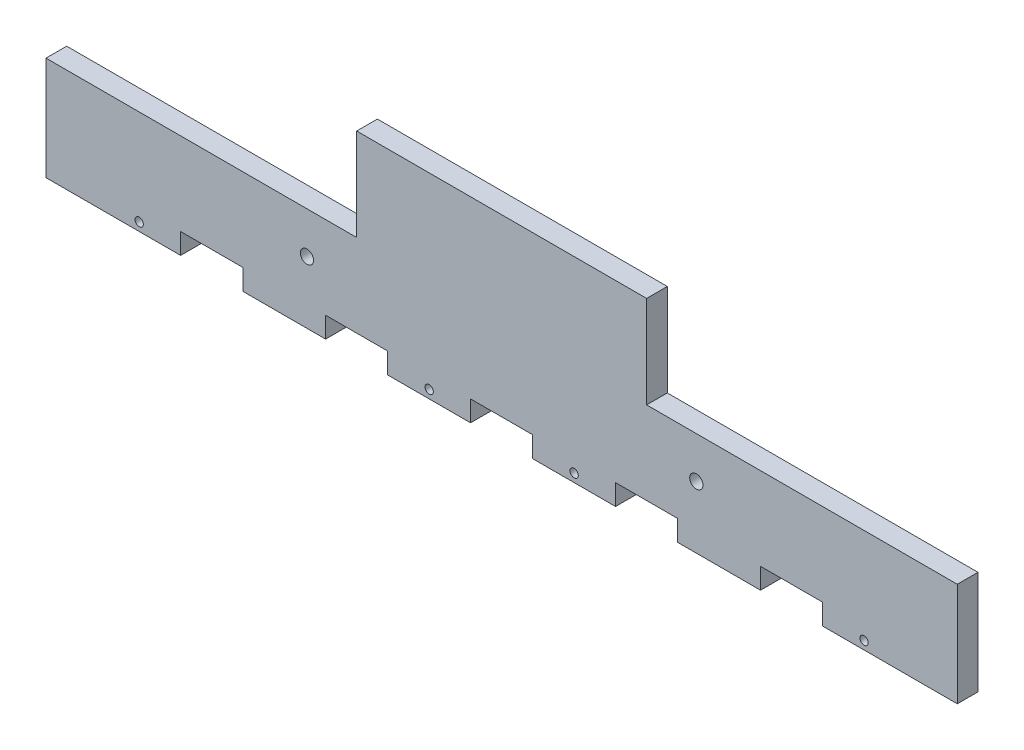
ISO-10303-21;
HEADER;
FILE_DESCRIPTION(('STEP AP214'),'2;1');
FILE_NAME('part.step','',(''),(''),'','','');
FILE_SCHEMA(('AUTOMOTIVE_DESIGN { 1 0 10303 214 1 1 1 1 }'));
ENDSEC;
DATA;
#1=APPLICATION_CONTEXT('core data for automotive mechanical design processes');
#2=APPLICATION_PROTOCOL_DEFINITION('international standard','automotive_design',2000,#1);
#3=PRODUCT_CONTEXT('',#1,'mechanical');
#4=PRODUCT('Part','Part','',(#3));
#5=PRODUCT_RELATED_PRODUCT_CATEGORY('part','',(#4));
#6=PRODUCT_DEFINITION_FORMATION('','',#4);
#7=PRODUCT_DEFINITION_CONTEXT('part definition',#1,'design');
#8=PRODUCT_DEFINITION('design','',#6,#7);
#9=PRODUCT_DEFINITION_SHAPE('','',#8);
#10=(LENGTH_UNIT() NAMED_UNIT(*) SI_UNIT(.MILLI.,.METRE.));
#11=(NAMED_UNIT(*) PLANE_ANGLE_UNIT() SI_UNIT($,.RADIAN.));
#12=(NAMED_UNIT(*) SI_UNIT($,.STERADIAN.) SOLID_ANGLE_UNIT());
#13=UNCERTAINTY_MEASURE_WITH_UNIT(LENGTH_MEASURE(1.E-05),#10,'distance_accuracy_value','');
#14=(GEOMETRIC_REPRESENTATION_CONTEXT(3) GLOBAL_UNCERTAINTY_ASSIGNED_CONTEXT((#13)) GLOBAL_UNIT_ASSIGNED_CONTEXT((#10,
#11,#12)) REPRESENTATION_CONTEXT('',''));
#15=CARTESIAN_POINT('',(0.,0.,0.));
#16=DIRECTION('',(0.,0.,1.));
#17=DIRECTION('',(1.,0.,0.));
#18=AXIS2_PLACEMENT_3D('',#15,#16,#17);
#19=CARTESIAN_POINT('',(0.,0.,5.));
#20=DIRECTION('',(0.,1.,0.));
#21=DIRECTION('',(0.,0.,1.));
#22=AXIS2_PLACEMENT_3D('',#19,#20,#21);
#23=PLANE('',#22);
#24=DIRECTION('',(1.,0.,0.));
#25=VECTOR('',#24,1.);
#26=CARTESIAN_POINT('',(0.,0.,0.));
#27=LINE('',#26,#25);
#28=CARTESIAN_POINT('',(0.,0.,0.));
#29=VERTEX_POINT('',#28);
#30=CARTESIAN_POINT('',(32.5,0.,0.));
#31=VERTEX_POINT('',#30);
#32=EDGE_CURVE('E263',#29,#31,#27,.T.);
#33=ORIENTED_EDGE('',*,*,#32,.T.);
#34=DIRECTION('',(0.,0.,1.));
#35=VECTOR('',#34,1.);
#36=CARTESIAN_POINT('',(32.5,0.,0.));
#37=LINE('',#36,#35);
#38=CARTESIAN_POINT('',(32.5,0.,5.));
#39=VERTEX_POINT('',#38);
#40=EDGE_CURVE('E394',#31,#39,#37,.T.);
#41=ORIENTED_EDGE('',*,*,#40,.T.);
#42=DIRECTION('',(1.,0.,0.));
#43=VECTOR('',#42,1.);
#44=CARTESIAN_POINT('',(0.,0.,5.));
#45=LINE('',#44,#43);
#46=CARTESIAN_POINT('',(0.,0.,5.));
#47=VERTEX_POINT('',#46);
#48=EDGE_CURVE('E319',#47,#39,#45,.T.);
#49=ORIENTED_EDGE('',*,*,#48,.F.);
#50=DIRECTION('',(0.,0.,-1.));
#51=VECTOR('',#50,1.);
#52=CARTESIAN_POINT('',(0.,0.,5.));
#53=LINE('',#52,#51);
#54=EDGE_CURVE('E11',#47,#29,#53,.T.);
#55=ORIENTED_EDGE('',*,*,#54,.T.);
#56=EDGE_LOOP('',(#33,#41,#49,#55));
#57=FACE_BOUND('',#56,.T.);
#58=ADVANCED_FACE('F38',(#57),#23,.F.);
#59=CARTESIAN_POINT('',(82.5,0.,5.));
#60=VERTEX_POINT('',#59);
#61=CARTESIAN_POINT('',(102.5,0.,5.));
#62=VERTEX_POINT('',#61);
#63=EDGE_CURVE('E609',#60,#62,#45,.T.);
#64=ORIENTED_EDGE('',*,*,#63,.F.);
#65=DIRECTION('',(0.,0.,1.));
#66=VECTOR('',#65,1.);
#67=CARTESIAN_POINT('',(82.5,0.,0.));
#68=LINE('',#67,#66);
#69=CARTESIAN_POINT('',(82.5,0.,0.));
#70=VERTEX_POINT('',#69);
#71=EDGE_CURVE('E439',#70,#60,#68,.T.);
#72=ORIENTED_EDGE('',*,*,#71,.F.);
#73=CARTESIAN_POINT('',(102.5,0.,0.));
#74=VERTEX_POINT('',#73);
#75=EDGE_CURVE('E254',#70,#74,#27,.T.);
#76=ORIENTED_EDGE('',*,*,#75,.T.);
#77=DIRECTION('',(0.,0.,1.));
#78=VECTOR('',#77,1.);
#79=CARTESIAN_POINT('',(102.5,0.,0.));
#80=LINE('',#79,#78);
#81=EDGE_CURVE('E360',#74,#62,#80,.T.);
#82=ORIENTED_EDGE('',*,*,#81,.T.);
#83=EDGE_LOOP('',(#64,#72,#76,#82));
#84=FACE_BOUND('',#83,.T.);
#85=ADVANCED_FACE('F658',(#84),#23,.F.);
#86=CARTESIAN_POINT('',(152.5,0.,0.));
#87=VERTEX_POINT('',#86);
#88=CARTESIAN_POINT('',(172.5,0.,0.));
#89=VERTEX_POINT('',#88);
#90=EDGE_CURVE('E255',#87,#89,#27,.T.);
#91=ORIENTED_EDGE('',*,*,#90,.T.);
#92=DIRECTION('',(0.,0.,1.));
#93=VECTOR('',#92,1.);
#94=CARTESIAN_POINT('',(172.5,0.,0.));
#95=LINE('',#94,#93);
#96=CARTESIAN_POINT('',(172.5,0.,5.));
#97=VERTEX_POINT('',#96);
#98=EDGE_CURVE('E463',#89,#97,#95,.T.);
#99=ORIENTED_EDGE('',*,*,#98,.T.);
#100=CARTESIAN_POINT('',(152.5,0.,5.));
#101=VERTEX_POINT('',#100);
#102=EDGE_CURVE('E617',#101,#97,#45,.T.);
#103=ORIENTED_EDGE('',*,*,#102,.F.);
#104=DIRECTION('',(0.,0.,1.));
#105=VECTOR('',#104,1.);
#106=CARTESIAN_POINT('',(152.5,0.,0.));
#107=LINE('',#106,#105);
#108=EDGE_CURVE('E236',#87,#101,#107,.T.);
#109=ORIENTED_EDGE('',*,*,#108,.F.);
#110=EDGE_LOOP('',(#91,#99,#103,#109));
#111=FACE_BOUND('',#110,.T.);
#112=ADVANCED_FACE('F639',(#111),#23,.F.);
#113=CARTESIAN_POINT('',(117.5,0.,0.));
#114=VERTEX_POINT('',#113);
#115=CARTESIAN_POINT('',(137.5,0.,0.));
#116=VERTEX_POINT('',#115);
#117=EDGE_CURVE('E244',#114,#116,#27,.T.);
#118=ORIENTED_EDGE('',*,*,#117,.T.);
#119=DIRECTION('',(0.,0.,1.));
#120=VECTOR('',#119,1.);
#121=CARTESIAN_POINT('',(137.5,0.,0.));
#122=LINE('',#121,#120);
#123=CARTESIAN_POINT('',(137.5,0.,5.));
#124=VERTEX_POINT('',#123);
#125=EDGE_CURVE('E224',#116,#124,#122,.T.);
#126=ORIENTED_EDGE('',*,*,#125,.T.);
#127=CARTESIAN_POINT('',(117.5,0.,5.));
#128=VERTEX_POINT('',#127);
#129=EDGE_CURVE('E612',#128,#124,#45,.T.);
#130=ORIENTED_EDGE('',*,*,#129,.F.);
#131=DIRECTION('',(0.,0.,1.));
#132=VECTOR('',#131,1.);
#133=CARTESIAN_POINT('',(117.5,0.,0.));
#134=LINE('',#133,#132);
#135=EDGE_CURVE('E252',#114,#128,#134,.T.);
#136=ORIENTED_EDGE('',*,*,#135,.F.);
#137=EDGE_LOOP('',(#118,#126,#130,#136));
#138=FACE_BOUND('',#137,.T.);
#139=ADVANCED_FACE('F251',(#138),#23,.F.);
#140=CARTESIAN_POINT('',(47.5,0.,5.));
#141=VERTEX_POINT('',#140);
#142=CARTESIAN_POINT('',(67.5,0.,5.));
#143=VERTEX_POINT('',#142);
#144=EDGE_CURVE('E323',#141,#143,#45,.T.);
#145=ORIENTED_EDGE('',*,*,#144,.F.);
#146=DIRECTION('',(0.,0.,1.));
#147=VECTOR('',#146,1.);
#148=CARTESIAN_POINT('',(47.5,0.,0.));
#149=LINE('',#148,#147);
#150=CARTESIAN_POINT('',(47.5,0.,0.));
#151=VERTEX_POINT('',#150);
#152=EDGE_CURVE('E398',#151,#141,#149,.T.);
#153=ORIENTED_EDGE('',*,*,#152,.F.);
#154=CARTESIAN_POINT('',(67.5,0.,0.));
#155=VERTEX_POINT('',#154);
#156=EDGE_CURVE('E260',#151,#155,#27,.T.);
#157=ORIENTED_EDGE('',*,*,#156,.T.);
#158=DIRECTION('',(0.,0.,1.));
#159=VECTOR('',#158,1.);
#160=CARTESIAN_POINT('',(67.5,0.,0.));
#161=LINE('',#160,#159);
#162=EDGE_CURVE('E435',#155,#143,#161,.T.);
#163=ORIENTED_EDGE('',*,*,#162,.T.);
#164=EDGE_LOOP('',(#145,#153,#157,#163));
#165=FACE_BOUND('',#164,.T.);
#166=ADVANCED_FACE('F605',(#165),#23,.F.);
#167=CARTESIAN_POINT('',(0.,25.,5.));
#168=DIRECTION('',(0.,-1.,0.));
#169=DIRECTION('',(0.,0.,-1.));
#170=AXIS2_PLACEMENT_3D('',#167,#168,#169);
#171=PLANE('',#170);
#172=DIRECTION('',(0.,0.,1.));
#173=VECTOR('',#172,1.);
#174=CARTESIAN_POINT('',(75.,25.,0.));
#175=LINE('',#174,#173);
#176=CARTESIAN_POINT('',(75.,25.,0.));
#177=VERTEX_POINT('',#176);
#178=CARTESIAN_POINT('',(75.,25.,5.));
#179=VERTEX_POINT('',#178);
#180=EDGE_CURVE('E328',#177,#179,#175,.T.);
#181=ORIENTED_EDGE('',*,*,#180,.F.);
#182=DIRECTION('',(-1.,0.,0.));
#183=VECTOR('',#182,1.);
#184=CARTESIAN_POINT('',(0.,25.,0.));
#185=LINE('',#184,#183);
#186=CARTESIAN_POINT('',(0.,25.,0.));
#187=VERTEX_POINT('',#186);
#188=EDGE_CURVE('E273',#177,#187,#185,.T.);
#189=ORIENTED_EDGE('',*,*,#188,.T.);
#190=DIRECTION('',(0.,0.,-1.));
#191=VECTOR('',#190,1.);
#192=CARTESIAN_POINT('',(0.,25.,5.));
#193=LINE('',#192,#191);
#194=CARTESIAN_POINT('',(0.,25.,5.));
#195=VERTEX_POINT('',#194);
#196=EDGE_CURVE('E279',#195,#187,#193,.T.);
#197=ORIENTED_EDGE('',*,*,#196,.F.);
#198=DIRECTION('',(-1.,0.,0.));
#199=VECTOR('',#198,1.);
#200=CARTESIAN_POINT('',(0.,25.,5.));
#201=LINE('',#200,#199);
#202=EDGE_CURVE('E314',#179,#195,#201,.T.);
#203=ORIENTED_EDGE('',*,*,#202,.F.);
#204=EDGE_LOOP('',(#181,#189,#197,#203));
#205=FACE_BOUND('',#204,.T.);
#206=ADVANCED_FACE('F669',(#205),#171,.F.);
#207=CARTESIAN_POINT('',(0.,0.,5.));
#208=DIRECTION('',(1.,0.,0.));
#209=DIRECTION('',(0.,0.,-1.));
#210=AXIS2_PLACEMENT_3D('',#207,#208,#209);
#211=PLANE('',#210);
#212=DIRECTION('',(0.,-1.,0.));
#213=VECTOR('',#212,1.);
#214=CARTESIAN_POINT('',(0.,0.,0.));
#215=LINE('',#214,#213);
#216=EDGE_CURVE('E269',#187,#29,#215,.T.);
#217=ORIENTED_EDGE('',*,*,#216,.T.);
#218=ORIENTED_EDGE('',*,*,#54,.F.);
#219=DIRECTION('',(0.,-1.,0.));
#220=VECTOR('',#219,1.);
#221=CARTESIAN_POINT('',(0.,0.,5.));
#222=LINE('',#221,#220);
#223=EDGE_CURVE('E278',#195,#47,#222,.T.);
#224=ORIENTED_EDGE('',*,*,#223,.F.);
#225=ORIENTED_EDGE('',*,*,#196,.T.);
#226=EDGE_LOOP('',(#217,#218,#224,#225));
#227=FACE_BOUND('',#226,.T.);
#228=ADVANCED_FACE('F40',(#227),#211,.F.);
#229=CARTESIAN_POINT('',(187.5,0.,5.));
#230=VERTEX_POINT('',#229);
#231=CARTESIAN_POINT('',(220.,0.,5.));
#232=VERTEX_POINT('',#231);
#233=EDGE_CURVE('E324',#230,#232,#45,.T.);
#234=ORIENTED_EDGE('',*,*,#233,.F.);
#235=DIRECTION('',(0.,0.,1.));
#236=VECTOR('',#235,1.);
#237=CARTESIAN_POINT('',(187.5,0.,0.));
#238=LINE('',#237,#236);
#239=CARTESIAN_POINT('',(187.5,0.,0.));
#240=VERTEX_POINT('',#239);
#241=EDGE_CURVE('E467',#240,#230,#238,.T.);
#242=ORIENTED_EDGE('',*,*,#241,.F.);
#243=CARTESIAN_POINT('',(220.,0.,0.));
#244=VERTEX_POINT('',#243);
#245=EDGE_CURVE('E262',#240,#244,#27,.T.);
#246=ORIENTED_EDGE('',*,*,#245,.T.);
#247=DIRECTION('',(0.,0.,-1.));
#248=VECTOR('',#247,1.);
#249=CARTESIAN_POINT('',(220.,0.,5.));
#250=LINE('',#249,#248);
#251=EDGE_CURVE('E47',#232,#244,#250,.T.);
#252=ORIENTED_EDGE('',*,*,#251,.F.);
#253=EDGE_LOOP('',(#234,#242,#246,#252));
#254=FACE_BOUND('',#253,.T.);
#255=ADVANCED_FACE('F628',(#254),#23,.F.);
#256=CARTESIAN_POINT('',(220.,0.,5.));
#257=DIRECTION('',(-1.,0.,0.));
#258=DIRECTION('',(0.,0.,1.));
#259=AXIS2_PLACEMENT_3D('',#256,#257,#258);
#260=PLANE('',#259);
#261=DIRECTION('',(0.,1.,0.));
#262=VECTOR('',#261,1.);
#263=CARTESIAN_POINT('',(220.,0.,0.));
#264=LINE('',#263,#262);
#265=CARTESIAN_POINT('',(220.,25.,0.));
#266=VERTEX_POINT('',#265);
#267=EDGE_CURVE('E268',#244,#266,#264,.T.);
#268=ORIENTED_EDGE('',*,*,#267,.T.);
#269=DIRECTION('',(0.,0.,-1.));
#270=VECTOR('',#269,1.);
#271=CARTESIAN_POINT('',(220.,25.,5.));
#272=LINE('',#271,#270);
#273=CARTESIAN_POINT('',(220.,25.,5.));
#274=VERTEX_POINT('',#273);
#275=EDGE_CURVE('E283',#274,#266,#272,.T.);
#276=ORIENTED_EDGE('',*,*,#275,.F.);
#277=DIRECTION('',(0.,1.,0.));
#278=VECTOR('',#277,1.);
#279=CARTESIAN_POINT('',(220.,0.,5.));
#280=LINE('',#279,#278);
#281=EDGE_CURVE('E295',#232,#274,#280,.T.);
#282=ORIENTED_EDGE('',*,*,#281,.F.);
#283=ORIENTED_EDGE('',*,*,#251,.T.);
#284=EDGE_LOOP('',(#268,#276,#282,#283));
#285=FACE_BOUND('',#284,.T.);
#286=ADVANCED_FACE('F293',(#285),#260,.F.);
#287=CARTESIAN_POINT('',(145.,25.,0.));
#288=VERTEX_POINT('',#287);
#289=EDGE_CURVE('E274',#266,#288,#185,.T.);
#290=ORIENTED_EDGE('',*,*,#289,.T.);
#291=DIRECTION('',(0.,0.,1.));
#292=VECTOR('',#291,1.);
#293=CARTESIAN_POINT('',(145.,25.,0.));
#294=LINE('',#293,#292);
#295=CARTESIAN_POINT('',(145.,25.,5.));
#296=VERTEX_POINT('',#295);
#297=EDGE_CURVE('E309',#288,#296,#294,.T.);
#298=ORIENTED_EDGE('',*,*,#297,.T.);
#299=EDGE_CURVE('E284',#274,#296,#201,.T.);
#300=ORIENTED_EDGE('',*,*,#299,.F.);
#301=ORIENTED_EDGE('',*,*,#275,.T.);
#302=EDGE_LOOP('',(#290,#298,#300,#301));
#303=FACE_BOUND('',#302,.T.);
#304=ADVANCED_FACE('F307',(#303),#171,.F.);
#305=CARTESIAN_POINT('',(0.,0.,5.));
#306=DIRECTION('',(0.,0.,-1.));
#307=DIRECTION('',(-1.,0.,0.));
#308=AXIS2_PLACEMENT_3D('',#305,#306,#307);
#309=PLANE('',#308);
#310=CARTESIAN_POINT('',(22.5,2.,5.));
#311=DIRECTION('',(0.,0.,1.));
#312=DIRECTION('',(1.,0.,0.));
#313=AXIS2_PLACEMENT_3D('',#310,#311,#312);
#314=CIRCLE('',#313,1.);
#315=CARTESIAN_POINT('',(23.5,2.,5.));
#316=VERTEX_POINT('',#315);
#317=EDGE_CURVE('E557',#316,#316,#314,.T.);
#318=ORIENTED_EDGE('',*,*,#317,.F.);
#319=EDGE_LOOP('',(#318));
#320=FACE_BOUND('',#319,.T.);
#321=CARTESIAN_POINT('',(92.5,2.,5.));
#322=DIRECTION('',(0.,0.,1.));
#323=DIRECTION('',(1.,0.,0.));
#324=AXIS2_PLACEMENT_3D('',#321,#322,#323);
#325=CIRCLE('',#324,0.999999999999998);
#326=CARTESIAN_POINT('',(93.5,2.,5.));
#327=VERTEX_POINT('',#326);
#328=EDGE_CURVE('E549',#327,#327,#325,.T.);
#329=ORIENTED_EDGE('',*,*,#328,.F.);
#330=EDGE_LOOP('',(#329));
#331=FACE_BOUND('',#330,.T.);
#332=CARTESIAN_POINT('',(127.5,2.,5.));
#333=DIRECTION('',(0.,0.,1.));
#334=DIRECTION('',(1.,0.,0.));
#335=AXIS2_PLACEMENT_3D('',#332,#333,#334);
#336=CIRCLE('',#335,0.999999999999998);
#337=CARTESIAN_POINT('',(128.5,2.,5.));
#338=VERTEX_POINT('',#337);
#339=EDGE_CURVE('E541',#338,#338,#336,.T.);
#340=ORIENTED_EDGE('',*,*,#339,.F.);
#341=EDGE_LOOP('',(#340));
#342=FACE_BOUND('',#341,.T.);
#343=CARTESIAN_POINT('',(197.5,2.,5.));
#344=DIRECTION('',(0.,0.,1.));
#345=DIRECTION('',(1.,0.,0.));
#346=AXIS2_PLACEMENT_3D('',#343,#344,#345);
#347=CIRCLE('',#346,0.999999999999998);
#348=CARTESIAN_POINT('',(198.5,2.,5.));
#349=VERTEX_POINT('',#348);
#350=EDGE_CURVE('E533',#349,#349,#347,.T.);
#351=ORIENTED_EDGE('',*,*,#350,.F.);
#352=EDGE_LOOP('',(#351));
#353=FACE_BOUND('',#352,.T.);
#354=CARTESIAN_POINT('',(63.,15.,5.));
#355=DIRECTION('',(0.,0.,1.));
#356=DIRECTION('',(1.,0.,0.));
#357=AXIS2_PLACEMENT_3D('',#354,#355,#356);
#358=CIRCLE('',#357,1.6);
#359=CARTESIAN_POINT('',(64.6,15.,5.));
#360=VERTEX_POINT('',#359);
#361=EDGE_CURVE('E526',#360,#360,#358,.T.);
#362=ORIENTED_EDGE('',*,*,#361,.F.);
#363=EDGE_LOOP('',(#362));
#364=FACE_BOUND('',#363,.T.);
#365=CARTESIAN_POINT('',(157.,15.,5.));
#366=DIRECTION('',(0.,0.,1.));
#367=DIRECTION('',(1.,0.,0.));
#368=AXIS2_PLACEMENT_3D('',#365,#366,#367);
#369=CIRCLE('',#368,1.59999999999999);
#370=CARTESIAN_POINT('',(158.6,15.,5.));
#371=VERTEX_POINT('',#370);
#372=EDGE_CURVE('E517',#371,#371,#369,.T.);
#373=ORIENTED_EDGE('',*,*,#372,.F.);
#374=EDGE_LOOP('',(#373));
#375=FACE_BOUND('',#374,.T.);
#376=ORIENTED_EDGE('',*,*,#48,.T.);
#377=DIRECTION('',(0.,-1.,0.));
#378=VECTOR('',#377,1.);
#379=CARTESIAN_POINT('',(32.5,0.,5.));
#380=LINE('',#379,#378);
#381=CARTESIAN_POINT('',(32.5,5.,5.));
#382=VERTEX_POINT('',#381);
#383=EDGE_CURVE('E417',#382,#39,#380,.T.);
#384=ORIENTED_EDGE('',*,*,#383,.F.);
#385=DIRECTION('',(-1.,0.,0.));
#386=VECTOR('',#385,1.);
#387=CARTESIAN_POINT('',(32.5,5.,5.));
#388=LINE('',#387,#386);
#389=CARTESIAN_POINT('',(47.5,5.,5.));
#390=VERTEX_POINT('',#389);
#391=EDGE_CURVE('E408',#390,#382,#388,.T.);
#392=ORIENTED_EDGE('',*,*,#391,.F.);
#393=DIRECTION('',(0.,1.,0.));
#394=VECTOR('',#393,1.);
#395=CARTESIAN_POINT('',(47.5,0.,5.));
#396=LINE('',#395,#394);
#397=EDGE_CURVE('E413',#141,#390,#396,.T.);
#398=ORIENTED_EDGE('',*,*,#397,.F.);
#399=ORIENTED_EDGE('',*,*,#144,.T.);
#400=DIRECTION('',(0.,-1.,0.));
#401=VECTOR('',#400,1.);
#402=CARTESIAN_POINT('',(67.5,0.,5.));
#403=LINE('',#402,#401);
#404=CARTESIAN_POINT('',(67.5,5.,5.));
#405=VERTEX_POINT('',#404);
#406=EDGE_CURVE('E443',#405,#143,#403,.T.);
#407=ORIENTED_EDGE('',*,*,#406,.F.);
#408=DIRECTION('',(-1.,0.,0.));
#409=VECTOR('',#408,1.);
#410=CARTESIAN_POINT('',(82.5,5.,5.));
#411=LINE('',#410,#409);
#412=CARTESIAN_POINT('',(82.5,5.,5.));
#413=VERTEX_POINT('',#412);
#414=EDGE_CURVE('E447',#413,#405,#411,.T.);
#415=ORIENTED_EDGE('',*,*,#414,.F.);
#416=DIRECTION('',(0.,1.,0.));
#417=VECTOR('',#416,1.);
#418=CARTESIAN_POINT('',(82.5,0.,5.));
#419=LINE('',#418,#417);
#420=EDGE_CURVE('E407',#60,#413,#419,.T.);
#421=ORIENTED_EDGE('',*,*,#420,.F.);
#422=ORIENTED_EDGE('',*,*,#63,.T.);
#423=DIRECTION('',(0.,-1.,0.));
#424=VECTOR('',#423,1.);
#425=CARTESIAN_POINT('',(102.5,0.,5.));
#426=LINE('',#425,#424);
#427=CARTESIAN_POINT('',(102.5,5.,5.));
#428=VERTEX_POINT('',#427);
#429=EDGE_CURVE('E381',#428,#62,#426,.T.);
#430=ORIENTED_EDGE('',*,*,#429,.F.);
#431=DIRECTION('',(-1.,0.,0.));
#432=VECTOR('',#431,1.);
#433=CARTESIAN_POINT('',(102.5,5.,5.));
#434=LINE('',#433,#432);
#435=CARTESIAN_POINT('',(117.5,5.,5.));
#436=VERTEX_POINT('',#435);
#437=EDGE_CURVE('E372',#436,#428,#434,.T.);
#438=ORIENTED_EDGE('',*,*,#437,.F.);
#439=DIRECTION('',(0.,1.,0.));
#440=VECTOR('',#439,1.);
#441=CARTESIAN_POINT('',(117.5,0.,5.));
#442=LINE('',#441,#440);
#443=EDGE_CURVE('E377',#128,#436,#442,.T.);
#444=ORIENTED_EDGE('',*,*,#443,.F.);
#445=ORIENTED_EDGE('',*,*,#129,.T.);
#446=DIRECTION('',(0.,-1.,0.));
#447=VECTOR('',#446,1.);
#448=CARTESIAN_POINT('',(137.5,0.,5.));
#449=LINE('',#448,#447);
#450=CARTESIAN_POINT('',(137.5,5.,5.));
#451=VERTEX_POINT('',#450);
#452=EDGE_CURVE('E230',#451,#124,#449,.T.);
#453=ORIENTED_EDGE('',*,*,#452,.F.);
#454=DIRECTION('',(-1.,0.,0.));
#455=VECTOR('',#454,1.);
#456=CARTESIAN_POINT('',(137.5,5.,5.));
#457=LINE('',#456,#455);
#458=CARTESIAN_POINT('',(152.5,5.,5.));
#459=VERTEX_POINT('',#458);
#460=EDGE_CURVE('E248',#459,#451,#457,.T.);
#461=ORIENTED_EDGE('',*,*,#460,.F.);
#462=DIRECTION('',(0.,1.,0.));
#463=VECTOR('',#462,1.);
#464=CARTESIAN_POINT('',(152.5,0.,5.));
#465=LINE('',#464,#463);
#466=EDGE_CURVE('E507',#101,#459,#465,.T.);
#467=ORIENTED_EDGE('',*,*,#466,.F.);
#468=ORIENTED_EDGE('',*,*,#102,.T.);
#469=DIRECTION('',(0.,-1.,0.));
#470=VECTOR('',#469,1.);
#471=CARTESIAN_POINT('',(172.5,0.,5.));
#472=LINE('',#471,#470);
#473=CARTESIAN_POINT('',(172.5,5.,5.));
#474=VERTEX_POINT('',#473);
#475=EDGE_CURVE('E442',#474,#97,#472,.T.);
#476=ORIENTED_EDGE('',*,*,#475,.F.);
#477=DIRECTION('',(-1.,0.,0.));
#478=VECTOR('',#477,1.);
#479=CARTESIAN_POINT('',(172.5,5.,5.));
#480=LINE('',#479,#478);
#481=CARTESIAN_POINT('',(187.5,5.,5.));
#482=VERTEX_POINT('',#481);
#483=EDGE_CURVE('E477',#482,#474,#480,.T.);
#484=ORIENTED_EDGE('',*,*,#483,.F.);
#485=DIRECTION('',(0.,1.,0.));
#486=VECTOR('',#485,1.);
#487=CARTESIAN_POINT('',(187.5,0.,5.));
#488=LINE('',#487,#486);
#489=EDGE_CURVE('E482',#230,#482,#488,.T.);
#490=ORIENTED_EDGE('',*,*,#489,.F.);
#491=ORIENTED_EDGE('',*,*,#233,.T.);
#492=ORIENTED_EDGE('',*,*,#281,.T.);
#493=ORIENTED_EDGE('',*,*,#299,.T.);
#494=DIRECTION('',(0.,1.,0.));
#495=VECTOR('',#494,1.);
#496=CARTESIAN_POINT('',(145.,25.,5.));
#497=LINE('',#496,#495);
#498=CARTESIAN_POINT('',(145.,47.2634932198408,5.));
#499=VERTEX_POINT('',#498);
#500=EDGE_CURVE('E345',#296,#499,#497,.T.);
#501=ORIENTED_EDGE('',*,*,#500,.T.);
#502=DIRECTION('',(-1.,0.,0.));
#503=VECTOR('',#502,1.);
#504=CARTESIAN_POINT('',(75.,47.2634932198408,5.));
#505=LINE('',#504,#503);
#506=CARTESIAN_POINT('',(75.,47.2634932198408,5.));
#507=VERTEX_POINT('',#506);
#508=EDGE_CURVE('E340',#499,#507,#505,.T.);
#509=ORIENTED_EDGE('',*,*,#508,.T.);
#510=DIRECTION('',(0.,-1.,0.));
#511=VECTOR('',#510,1.);
#512=CARTESIAN_POINT('',(75.,25.,5.));
#513=LINE('',#512,#511);
#514=EDGE_CURVE('E348',#507,#179,#513,.T.);
#515=ORIENTED_EDGE('',*,*,#514,.T.);
#516=ORIENTED_EDGE('',*,*,#202,.T.);
#517=ORIENTED_EDGE('',*,*,#223,.T.);
#518=EDGE_LOOP('',(#376,#384,#392,#398,#399,#407,#415,#421,#422,#430,#438,#444,#445,#453,#461,
#467,#468,#476,#484,#490,#491,#492,#493,#501,#509,#515,#516,#517));
#519=FACE_BOUND('',#518,.T.);
#520=ADVANCED_FACE('F574',(#320,#331,#342,#353,#364,#375,#519),#309,.F.);
#521=CARTESIAN_POINT('',(0.,0.,0.));
#522=DIRECTION('',(0.,0.,-1.));
#523=DIRECTION('',(-1.,0.,0.));
#524=AXIS2_PLACEMENT_3D('',#521,#522,#523);
#525=PLANE('',#524);
#526=CARTESIAN_POINT('',(22.5,2.,0.));
#527=DIRECTION('',(0.,0.,1.));
#528=DIRECTION('',(1.,0.,0.));
#529=AXIS2_PLACEMENT_3D('',#526,#527,#528);
#530=CIRCLE('',#529,1.);
#531=CARTESIAN_POINT('',(23.5,2.,0.));
#532=VERTEX_POINT('',#531);
#533=EDGE_CURVE('E522',#532,#532,#530,.T.);
#534=ORIENTED_EDGE('',*,*,#533,.T.);
#535=EDGE_LOOP('',(#534));
#536=FACE_BOUND('',#535,.T.);
#537=CARTESIAN_POINT('',(92.5,2.,0.));
#538=DIRECTION('',(0.,0.,1.));
#539=DIRECTION('',(1.,0.,0.));
#540=AXIS2_PLACEMENT_3D('',#537,#538,#539);
#541=CIRCLE('',#540,0.999999999999998);
#542=CARTESIAN_POINT('',(93.5,2.,0.));
#543=VERTEX_POINT('',#542);
#544=EDGE_CURVE('E553',#543,#543,#541,.T.);
#545=ORIENTED_EDGE('',*,*,#544,.T.);
#546=EDGE_LOOP('',(#545));
#547=FACE_BOUND('',#546,.T.);
#548=CARTESIAN_POINT('',(127.5,2.,0.));
#549=DIRECTION('',(0.,0.,1.));
#550=DIRECTION('',(1.,0.,0.));
#551=AXIS2_PLACEMENT_3D('',#548,#549,#550);
#552=CIRCLE('',#551,0.999999999999998);
#553=CARTESIAN_POINT('',(128.5,2.,0.));
#554=VERTEX_POINT('',#553);
#555=EDGE_CURVE('E545',#554,#554,#552,.T.);
#556=ORIENTED_EDGE('',*,*,#555,.T.);
#557=EDGE_LOOP('',(#556));
#558=FACE_BOUND('',#557,.T.);
#559=CARTESIAN_POINT('',(197.5,2.,0.));
#560=DIRECTION('',(0.,0.,1.));
#561=DIRECTION('',(1.,0.,0.));
#562=AXIS2_PLACEMENT_3D('',#559,#560,#561);
#563=CIRCLE('',#562,0.999999999999998);
#564=CARTESIAN_POINT('',(198.5,2.,0.));
#565=VERTEX_POINT('',#564);
#566=EDGE_CURVE('E537',#565,#565,#563,.T.);
#567=ORIENTED_EDGE('',*,*,#566,.T.);
#568=EDGE_LOOP('',(#567));
#569=FACE_BOUND('',#568,.T.);
#570=CARTESIAN_POINT('',(63.,15.,0.));
#571=DIRECTION('',(0.,0.,1.));
#572=DIRECTION('',(1.,0.,0.));
#573=AXIS2_PLACEMENT_3D('',#570,#571,#572);
#574=CIRCLE('',#573,1.6);
#575=CARTESIAN_POINT('',(64.6,15.,0.));
#576=VERTEX_POINT('',#575);
#577=EDGE_CURVE('E420',#576,#576,#574,.T.);
#578=ORIENTED_EDGE('',*,*,#577,.T.);
#579=EDGE_LOOP('',(#578));
#580=FACE_BOUND('',#579,.T.);
#581=CARTESIAN_POINT('',(157.,15.,0.));
#582=DIRECTION('',(0.,0.,1.));
#583=DIRECTION('',(1.,0.,0.));
#584=AXIS2_PLACEMENT_3D('',#581,#582,#583);
#585=CIRCLE('',#584,1.59999999999999);
#586=CARTESIAN_POINT('',(158.6,15.,0.));
#587=VERTEX_POINT('',#586);
#588=EDGE_CURVE('E521',#587,#587,#585,.T.);
#589=ORIENTED_EDGE('',*,*,#588,.T.);
#590=EDGE_LOOP('',(#589));
#591=FACE_BOUND('',#590,.T.);
#592=DIRECTION('',(0.,-1.,0.));
#593=VECTOR('',#592,1.);
#594=CARTESIAN_POINT('',(32.5,0.,0.));
#595=LINE('',#594,#593);
#596=CARTESIAN_POINT('',(32.5,5.,0.));
#597=VERTEX_POINT('',#596);
#598=EDGE_CURVE('E412',#597,#31,#595,.T.);
#599=ORIENTED_EDGE('',*,*,#598,.T.);
#600=ORIENTED_EDGE('',*,*,#32,.F.);
#601=ORIENTED_EDGE('',*,*,#216,.F.);
#602=ORIENTED_EDGE('',*,*,#188,.F.);
#603=DIRECTION('',(0.,-1.,0.));
#604=VECTOR('',#603,1.);
#605=CARTESIAN_POINT('',(75.,25.,0.));
#606=LINE('',#605,#604);
#607=CARTESIAN_POINT('',(75.,47.2634932198408,0.));
#608=VERTEX_POINT('',#607);
#609=EDGE_CURVE('E344',#608,#177,#606,.T.);
#610=ORIENTED_EDGE('',*,*,#609,.F.);
#611=DIRECTION('',(-1.,0.,0.));
#612=VECTOR('',#611,1.);
#613=CARTESIAN_POINT('',(75.,47.2634932198408,0.));
#614=LINE('',#613,#612);
#615=CARTESIAN_POINT('',(145.,47.2634932198408,0.));
#616=VERTEX_POINT('',#615);
#617=EDGE_CURVE('E331',#616,#608,#614,.T.);
#618=ORIENTED_EDGE('',*,*,#617,.F.);
#619=DIRECTION('',(0.,1.,0.));
#620=VECTOR('',#619,1.);
#621=CARTESIAN_POINT('',(145.,25.,0.));
#622=LINE('',#621,#620);
#623=EDGE_CURVE('E304',#288,#616,#622,.T.);
#624=ORIENTED_EDGE('',*,*,#623,.F.);
#625=ORIENTED_EDGE('',*,*,#289,.F.);
#626=ORIENTED_EDGE('',*,*,#267,.F.);
#627=ORIENTED_EDGE('',*,*,#245,.F.);
#628=DIRECTION('',(0.,1.,0.));
#629=VECTOR('',#628,1.);
#630=CARTESIAN_POINT('',(187.5,0.,0.));
#631=LINE('',#630,#629);
#632=CARTESIAN_POINT('',(187.5,5.,0.));
#633=VERTEX_POINT('',#632);
#634=EDGE_CURVE('E491',#240,#633,#631,.T.);
#635=ORIENTED_EDGE('',*,*,#634,.T.);
#636=DIRECTION('',(-1.,0.,0.));
#637=VECTOR('',#636,1.);
#638=CARTESIAN_POINT('',(172.5,5.,0.));
#639=LINE('',#638,#637);
#640=CARTESIAN_POINT('',(172.5,5.,0.));
#641=VERTEX_POINT('',#640);
#642=EDGE_CURVE('E468',#633,#641,#639,.T.);
#643=ORIENTED_EDGE('',*,*,#642,.T.);
#644=DIRECTION('',(0.,-1.,0.));
#645=VECTOR('',#644,1.);
#646=CARTESIAN_POINT('',(172.5,0.,0.));
#647=LINE('',#646,#645);
#648=EDGE_CURVE('E481',#641,#89,#647,.T.);
#649=ORIENTED_EDGE('',*,*,#648,.T.);
#650=ORIENTED_EDGE('',*,*,#90,.F.);
#651=DIRECTION('',(0.,1.,0.));
#652=VECTOR('',#651,1.);
#653=CARTESIAN_POINT('',(152.5,0.,0.));
#654=LINE('',#653,#652);
#655=CARTESIAN_POINT('',(152.5,5.,0.));
#656=VERTEX_POINT('',#655);
#657=EDGE_CURVE('E247',#87,#656,#654,.T.);
#658=ORIENTED_EDGE('',*,*,#657,.T.);
#659=DIRECTION('',(-1.,0.,0.));
#660=VECTOR('',#659,1.);
#661=CARTESIAN_POINT('',(137.5,5.,0.));
#662=LINE('',#661,#660);
#663=CARTESIAN_POINT('',(137.5,5.,0.));
#664=VERTEX_POINT('',#663);
#665=EDGE_CURVE('E237',#656,#664,#662,.T.);
#666=ORIENTED_EDGE('',*,*,#665,.T.);
#667=DIRECTION('',(0.,-1.,0.));
#668=VECTOR('',#667,1.);
#669=CARTESIAN_POINT('',(137.5,0.,0.));
#670=LINE('',#669,#668);
#671=EDGE_CURVE('E227',#664,#116,#670,.T.);
#672=ORIENTED_EDGE('',*,*,#671,.T.);
#673=ORIENTED_EDGE('',*,*,#117,.F.);
#674=DIRECTION('',(0.,1.,0.));
#675=VECTOR('',#674,1.);
#676=CARTESIAN_POINT('',(117.5,0.,0.));
#677=LINE('',#676,#675);
#678=CARTESIAN_POINT('',(117.5,5.,0.));
#679=VERTEX_POINT('',#678);
#680=EDGE_CURVE('E388',#114,#679,#677,.T.);
#681=ORIENTED_EDGE('',*,*,#680,.T.);
#682=DIRECTION('',(-1.,0.,0.));
#683=VECTOR('',#682,1.);
#684=CARTESIAN_POINT('',(102.5,5.,0.));
#685=LINE('',#684,#683);
#686=CARTESIAN_POINT('',(102.5,5.,0.));
#687=VERTEX_POINT('',#686);
#688=EDGE_CURVE('E364',#679,#687,#685,.T.);
#689=ORIENTED_EDGE('',*,*,#688,.T.);
#690=DIRECTION('',(0.,-1.,0.));
#691=VECTOR('',#690,1.);
#692=CARTESIAN_POINT('',(102.5,0.,0.));
#693=LINE('',#692,#691);
#694=EDGE_CURVE('E376',#687,#74,#693,.T.);
#695=ORIENTED_EDGE('',*,*,#694,.T.);
#696=ORIENTED_EDGE('',*,*,#75,.F.);
#697=DIRECTION('',(0.,1.,0.));
#698=VECTOR('',#697,1.);
#699=CARTESIAN_POINT('',(82.5,0.,0.));
#700=LINE('',#699,#698);
#701=CARTESIAN_POINT('',(82.5,5.,0.));
#702=VERTEX_POINT('',#701);
#703=EDGE_CURVE('E446',#70,#702,#700,.T.);
#704=ORIENTED_EDGE('',*,*,#703,.T.);
#705=DIRECTION('',(-1.,0.,0.));
#706=VECTOR('',#705,1.);
#707=CARTESIAN_POINT('',(82.5,5.,0.));
#708=LINE('',#707,#706);
#709=CARTESIAN_POINT('',(67.5,5.,0.));
#710=VERTEX_POINT('',#709);
#711=EDGE_CURVE('E456',#702,#710,#708,.T.);
#712=ORIENTED_EDGE('',*,*,#711,.T.);
#713=DIRECTION('',(0.,-1.,0.));
#714=VECTOR('',#713,1.);
#715=CARTESIAN_POINT('',(67.5,0.,0.));
#716=LINE('',#715,#714);
#717=EDGE_CURVE('E62',#710,#155,#716,.T.);
#718=ORIENTED_EDGE('',*,*,#717,.T.);
#719=ORIENTED_EDGE('',*,*,#156,.F.);
#720=DIRECTION('',(0.,1.,0.));
#721=VECTOR('',#720,1.);
#722=CARTESIAN_POINT('',(47.5,0.,0.));
#723=LINE('',#722,#721);
#724=CARTESIAN_POINT('',(47.5,5.,0.));
#725=VERTEX_POINT('',#724);
#726=EDGE_CURVE('E423',#151,#725,#723,.T.);
#727=ORIENTED_EDGE('',*,*,#726,.T.);
#728=DIRECTION('',(-1.,0.,0.));
#729=VECTOR('',#728,1.);
#730=CARTESIAN_POINT('',(32.5,5.,0.));
#731=LINE('',#730,#729);
#732=EDGE_CURVE('E54',#725,#597,#731,.T.);
#733=ORIENTED_EDGE('',*,*,#732,.T.);
#734=EDGE_LOOP('',(#599,#600,#601,#602,#610,#618,#624,#625,#626,#627,#635,#643,#649,#650,#658,
#666,#672,#673,#681,#689,#695,#696,#704,#712,#718,#719,#727,#733));
#735=FACE_BOUND('',#734,.T.);
#736=ADVANCED_FACE('F242',(#536,#547,#558,#569,#580,#591,#735),#525,.T.);
#737=CARTESIAN_POINT('',(75.,25.,0.));
#738=DIRECTION('',(-1.,0.,0.));
#739=DIRECTION('',(0.,-1.,0.));
#740=AXIS2_PLACEMENT_3D('',#737,#738,#739);
#741=PLANE('',#740);
#742=ORIENTED_EDGE('',*,*,#514,.F.);
#743=DIRECTION('',(0.,0.,1.));
#744=VECTOR('',#743,1.);
#745=CARTESIAN_POINT('',(75.,47.2634932198408,0.));
#746=LINE('',#745,#744);
#747=EDGE_CURVE('E337',#608,#507,#746,.T.);
#748=ORIENTED_EDGE('',*,*,#747,.F.);
#749=ORIENTED_EDGE('',*,*,#609,.T.);
#750=ORIENTED_EDGE('',*,*,#180,.T.);
#751=EDGE_LOOP('',(#742,#748,#749,#750));
#752=FACE_BOUND('',#751,.T.);
#753=ADVANCED_FACE('F715',(#752),#741,.T.);
#754=CARTESIAN_POINT('',(75.,47.2634932198408,0.));
#755=DIRECTION('',(0.,1.,0.));
#756=DIRECTION('',(-1.,0.,0.));
#757=AXIS2_PLACEMENT_3D('',#754,#755,#756);
#758=PLANE('',#757);
#759=ORIENTED_EDGE('',*,*,#508,.F.);
#760=DIRECTION('',(0.,0.,1.));
#761=VECTOR('',#760,1.);
#762=CARTESIAN_POINT('',(145.,47.2634932198408,0.));
#763=LINE('',#762,#761);
#764=EDGE_CURVE('E334',#616,#499,#763,.T.);
#765=ORIENTED_EDGE('',*,*,#764,.F.);
#766=ORIENTED_EDGE('',*,*,#617,.T.);
#767=ORIENTED_EDGE('',*,*,#747,.T.);
#768=EDGE_LOOP('',(#759,#765,#766,#767));
#769=FACE_BOUND('',#768,.T.);
#770=ADVANCED_FACE('F703',(#769),#758,.T.);
#771=CARTESIAN_POINT('',(145.,25.,0.));
#772=DIRECTION('',(1.,0.,0.));
#773=DIRECTION('',(0.,0.,-1.));
#774=AXIS2_PLACEMENT_3D('',#771,#772,#773);
#775=PLANE('',#774);
#776=ORIENTED_EDGE('',*,*,#500,.F.);
#777=ORIENTED_EDGE('',*,*,#297,.F.);
#778=ORIENTED_EDGE('',*,*,#623,.T.);
#779=ORIENTED_EDGE('',*,*,#764,.T.);
#780=EDGE_LOOP('',(#776,#777,#778,#779));
#781=FACE_BOUND('',#780,.T.);
#782=ADVANCED_FACE('F697',(#781),#775,.T.);
#783=CARTESIAN_POINT('',(102.5,0.,0.));
#784=DIRECTION('',(-1.,0.,0.));
#785=DIRECTION('',(0.,0.,1.));
#786=AXIS2_PLACEMENT_3D('',#783,#784,#785);
#787=PLANE('',#786);
#788=ORIENTED_EDGE('',*,*,#429,.T.);
#789=ORIENTED_EDGE('',*,*,#81,.F.);
#790=ORIENTED_EDGE('',*,*,#694,.F.);
#791=DIRECTION('',(0.,0.,1.));
#792=VECTOR('',#791,1.);
#793=CARTESIAN_POINT('',(102.5,5.,0.));
#794=LINE('',#793,#792);
#795=EDGE_CURVE('E352',#687,#428,#794,.T.);
#796=ORIENTED_EDGE('',*,*,#795,.T.);
#797=EDGE_LOOP('',(#788,#789,#790,#796));
#798=FACE_BOUND('',#797,.T.);
#799=ADVANCED_FACE('F702',(#798),#787,.F.);
#800=CARTESIAN_POINT('',(102.5,5.,0.));
#801=DIRECTION('',(0.,1.,0.));
#802=DIRECTION('',(-1.,0.,0.));
#803=AXIS2_PLACEMENT_3D('',#800,#801,#802);
#804=PLANE('',#803);
#805=ORIENTED_EDGE('',*,*,#437,.T.);
#806=ORIENTED_EDGE('',*,*,#795,.F.);
#807=ORIENTED_EDGE('',*,*,#688,.F.);
#808=DIRECTION('',(0.,0.,1.));
#809=VECTOR('',#808,1.);
#810=CARTESIAN_POINT('',(117.5,5.,0.));
#811=LINE('',#810,#809);
#812=EDGE_CURVE('E367',#679,#436,#811,.T.);
#813=ORIENTED_EDGE('',*,*,#812,.T.);
#814=EDGE_LOOP('',(#805,#806,#807,#813));
#815=FACE_BOUND('',#814,.T.);
#816=ADVANCED_FACE('F768',(#815),#804,.F.);
#817=CARTESIAN_POINT('',(117.5,0.,0.));
#818=DIRECTION('',(1.,0.,0.));
#819=DIRECTION('',(0.,1.,0.));
#820=AXIS2_PLACEMENT_3D('',#817,#818,#819);
#821=PLANE('',#820);
#822=ORIENTED_EDGE('',*,*,#443,.T.);
#823=ORIENTED_EDGE('',*,*,#812,.F.);
#824=ORIENTED_EDGE('',*,*,#680,.F.);
#825=ORIENTED_EDGE('',*,*,#135,.T.);
#826=EDGE_LOOP('',(#822,#823,#824,#825));
#827=FACE_BOUND('',#826,.T.);
#828=ADVANCED_FACE('F654',(#827),#821,.F.);
#829=CARTESIAN_POINT('',(137.5,0.,0.));
#830=DIRECTION('',(-1.,0.,0.));
#831=DIRECTION('',(0.,0.,1.));
#832=AXIS2_PLACEMENT_3D('',#829,#830,#831);
#833=PLANE('',#832);
#834=ORIENTED_EDGE('',*,*,#452,.T.);
#835=ORIENTED_EDGE('',*,*,#125,.F.);
#836=ORIENTED_EDGE('',*,*,#671,.F.);
#837=DIRECTION('',(0.,0.,1.));
#838=VECTOR('',#837,1.);
#839=CARTESIAN_POINT('',(137.5,5.,0.));
#840=LINE('',#839,#838);
#841=EDGE_CURVE('E384',#664,#451,#840,.T.);
#842=ORIENTED_EDGE('',*,*,#841,.T.);
#843=EDGE_LOOP('',(#834,#835,#836,#842));
#844=FACE_BOUND('',#843,.T.);
#845=ADVANCED_FACE('F226',(#844),#833,.F.);
#846=CARTESIAN_POINT('',(137.5,5.,0.));
#847=DIRECTION('',(0.,1.,0.));
#848=DIRECTION('',(0.,0.,1.));
#849=AXIS2_PLACEMENT_3D('',#846,#847,#848);
#850=PLANE('',#849);
#851=ORIENTED_EDGE('',*,*,#460,.T.);
#852=ORIENTED_EDGE('',*,*,#841,.F.);
#853=ORIENTED_EDGE('',*,*,#665,.F.);
#854=DIRECTION('',(0.,0.,1.));
#855=VECTOR('',#854,1.);
#856=CARTESIAN_POINT('',(152.5,5.,0.));
#857=LINE('',#856,#855);
#858=EDGE_CURVE('E499',#656,#459,#857,.T.);
#859=ORIENTED_EDGE('',*,*,#858,.T.);
#860=EDGE_LOOP('',(#851,#852,#853,#859));
#861=FACE_BOUND('',#860,.T.);
#862=ADVANCED_FACE('F646',(#861),#850,.F.);
#863=CARTESIAN_POINT('',(152.5,0.,0.));
#864=DIRECTION('',(1.,0.,0.));
#865=DIRECTION('',(0.,0.,-1.));
#866=AXIS2_PLACEMENT_3D('',#863,#864,#865);
#867=PLANE('',#866);
#868=ORIENTED_EDGE('',*,*,#466,.T.);
#869=ORIENTED_EDGE('',*,*,#858,.F.);
#870=ORIENTED_EDGE('',*,*,#657,.F.);
#871=ORIENTED_EDGE('',*,*,#108,.T.);
#872=EDGE_LOOP('',(#868,#869,#870,#871));
#873=FACE_BOUND('',#872,.T.);
#874=ADVANCED_FACE('F643',(#873),#867,.F.);
#875=CARTESIAN_POINT('',(172.5,0.,0.));
#876=DIRECTION('',(-1.,0.,0.));
#877=DIRECTION('',(0.,0.,1.));
#878=AXIS2_PLACEMENT_3D('',#875,#876,#877);
#879=PLANE('',#878);
#880=ORIENTED_EDGE('',*,*,#475,.T.);
#881=ORIENTED_EDGE('',*,*,#98,.F.);
#882=ORIENTED_EDGE('',*,*,#648,.F.);
#883=DIRECTION('',(0.,0.,1.));
#884=VECTOR('',#883,1.);
#885=CARTESIAN_POINT('',(172.5,5.,0.));
#886=LINE('',#885,#884);
#887=EDGE_CURVE('E474',#641,#474,#886,.T.);
#888=ORIENTED_EDGE('',*,*,#887,.T.);
#889=EDGE_LOOP('',(#880,#881,#882,#888));
#890=FACE_BOUND('',#889,.T.);
#891=ADVANCED_FACE('F637',(#890),#879,.F.);
#892=CARTESIAN_POINT('',(172.5,5.,0.));
#893=DIRECTION('',(0.,1.,0.));
#894=DIRECTION('',(0.,0.,1.));
#895=AXIS2_PLACEMENT_3D('',#892,#893,#894);
#896=PLANE('',#895);
#897=ORIENTED_EDGE('',*,*,#483,.T.);
#898=ORIENTED_EDGE('',*,*,#887,.F.);
#899=ORIENTED_EDGE('',*,*,#642,.F.);
#900=DIRECTION('',(0.,0.,1.));
#901=VECTOR('',#900,1.);
#902=CARTESIAN_POINT('',(187.5,5.,0.));
#903=LINE('',#902,#901);
#904=EDGE_CURVE('E471',#633,#482,#903,.T.);
#905=ORIENTED_EDGE('',*,*,#904,.T.);
#906=EDGE_LOOP('',(#897,#898,#899,#905));
#907=FACE_BOUND('',#906,.T.);
#908=ADVANCED_FACE('F635',(#907),#896,.F.);
#909=CARTESIAN_POINT('',(187.5,0.,0.));
#910=DIRECTION('',(1.,0.,0.));
#911=DIRECTION('',(0.,0.,-1.));
#912=AXIS2_PLACEMENT_3D('',#909,#910,#911);
#913=PLANE('',#912);
#914=ORIENTED_EDGE('',*,*,#489,.T.);
#915=ORIENTED_EDGE('',*,*,#904,.F.);
#916=ORIENTED_EDGE('',*,*,#634,.F.);
#917=ORIENTED_EDGE('',*,*,#241,.T.);
#918=EDGE_LOOP('',(#914,#915,#916,#917));
#919=FACE_BOUND('',#918,.T.);
#920=ADVANCED_FACE('F630',(#919),#913,.F.);
#921=CARTESIAN_POINT('',(82.5,0.,0.));
#922=DIRECTION('',(1.,0.,0.));
#923=DIRECTION('',(0.,0.,-1.));
#924=AXIS2_PLACEMENT_3D('',#921,#922,#923);
#925=PLANE('',#924);
#926=ORIENTED_EDGE('',*,*,#420,.T.);
#927=DIRECTION('',(0.,0.,1.));
#928=VECTOR('',#927,1.);
#929=CARTESIAN_POINT('',(82.5,5.,0.));
#930=LINE('',#929,#928);
#931=EDGE_CURVE('E429',#702,#413,#930,.T.);
#932=ORIENTED_EDGE('',*,*,#931,.F.);
#933=ORIENTED_EDGE('',*,*,#703,.F.);
#934=ORIENTED_EDGE('',*,*,#71,.T.);
#935=EDGE_LOOP('',(#926,#932,#933,#934));
#936=FACE_BOUND('',#935,.T.);
#937=ADVANCED_FACE('F828',(#936),#925,.F.);
#938=CARTESIAN_POINT('',(67.5,0.,0.));
#939=DIRECTION('',(-1.,0.,0.));
#940=DIRECTION('',(0.,0.,1.));
#941=AXIS2_PLACEMENT_3D('',#938,#939,#940);
#942=PLANE('',#941);
#943=ORIENTED_EDGE('',*,*,#406,.T.);
#944=ORIENTED_EDGE('',*,*,#162,.F.);
#945=ORIENTED_EDGE('',*,*,#717,.F.);
#946=DIRECTION('',(0.,0.,1.));
#947=VECTOR('',#946,1.);
#948=CARTESIAN_POINT('',(67.5,5.,0.));
#949=LINE('',#948,#947);
#950=EDGE_CURVE('E432',#710,#405,#949,.T.);
#951=ORIENTED_EDGE('',*,*,#950,.T.);
#952=EDGE_LOOP('',(#943,#944,#945,#951));
#953=FACE_BOUND('',#952,.T.);
#954=ADVANCED_FACE('F837',(#953),#942,.F.);
#955=CARTESIAN_POINT('',(82.5,5.,0.));
#956=DIRECTION('',(0.,1.,0.));
#957=DIRECTION('',(-1.,0.,0.));
#958=AXIS2_PLACEMENT_3D('',#955,#956,#957);
#959=PLANE('',#958);
#960=ORIENTED_EDGE('',*,*,#414,.T.);
#961=ORIENTED_EDGE('',*,*,#950,.F.);
#962=ORIENTED_EDGE('',*,*,#711,.F.);
#963=ORIENTED_EDGE('',*,*,#931,.T.);
#964=EDGE_LOOP('',(#960,#961,#962,#963));
#965=FACE_BOUND('',#964,.T.);
#966=ADVANCED_FACE('F847',(#965),#959,.F.);
#967=CARTESIAN_POINT('',(32.5,0.,0.));
#968=DIRECTION('',(-1.,0.,0.));
#969=DIRECTION('',(0.,0.,1.));
#970=AXIS2_PLACEMENT_3D('',#967,#968,#969);
#971=PLANE('',#970);
#972=ORIENTED_EDGE('',*,*,#383,.T.);
#973=ORIENTED_EDGE('',*,*,#40,.F.);
#974=ORIENTED_EDGE('',*,*,#598,.F.);
#975=DIRECTION('',(0.,0.,1.));
#976=VECTOR('',#975,1.);
#977=CARTESIAN_POINT('',(32.5,5.,0.));
#978=LINE('',#977,#976);
#979=EDGE_CURVE('E404',#597,#382,#978,.T.);
#980=ORIENTED_EDGE('',*,*,#979,.T.);
#981=EDGE_LOOP('',(#972,#973,#974,#980));
#982=FACE_BOUND('',#981,.T.);
#983=ADVANCED_FACE('F595',(#982),#971,.F.);
#984=CARTESIAN_POINT('',(32.5,5.,0.));
#985=DIRECTION('',(0.,1.,0.));
#986=DIRECTION('',(0.,0.,1.));
#987=AXIS2_PLACEMENT_3D('',#984,#985,#986);
#988=PLANE('',#987);
#989=ORIENTED_EDGE('',*,*,#391,.T.);
#990=ORIENTED_EDGE('',*,*,#979,.F.);
#991=ORIENTED_EDGE('',*,*,#732,.F.);
#992=DIRECTION('',(0.,0.,1.));
#993=VECTOR('',#992,1.);
#994=CARTESIAN_POINT('',(47.5,5.,0.));
#995=LINE('',#994,#993);
#996=EDGE_CURVE('E401',#725,#390,#995,.T.);
#997=ORIENTED_EDGE('',*,*,#996,.T.);
#998=EDGE_LOOP('',(#989,#990,#991,#997));
#999=FACE_BOUND('',#998,.T.);
#1000=ADVANCED_FACE('F865',(#999),#988,.F.);
#1001=CARTESIAN_POINT('',(47.5,0.,0.));
#1002=DIRECTION('',(1.,0.,0.));
#1003=DIRECTION('',(0.,0.,-1.));
#1004=AXIS2_PLACEMENT_3D('',#1001,#1002,#1003);
#1005=PLANE('',#1004);
#1006=ORIENTED_EDGE('',*,*,#397,.T.);
#1007=ORIENTED_EDGE('',*,*,#996,.F.);
#1008=ORIENTED_EDGE('',*,*,#726,.F.);
#1009=ORIENTED_EDGE('',*,*,#152,.T.);
#1010=EDGE_LOOP('',(#1006,#1007,#1008,#1009));
#1011=FACE_BOUND('',#1010,.T.);
#1012=ADVANCED_FACE('F601',(#1011),#1005,.F.);
#1013=CARTESIAN_POINT('',(157.,15.,0.));
#1014=DIRECTION('',(0.,0.,1.));
#1015=DIRECTION('',(1.,0.,0.));
#1016=AXIS2_PLACEMENT_3D('',#1013,#1014,#1015);
#1017=CYLINDRICAL_SURFACE('',#1016,1.59999999999999);
#1018=ORIENTED_EDGE('',*,*,#588,.F.);
#1019=EDGE_LOOP('',(#1018));
#1020=FACE_BOUND('',#1019,.T.);
#1021=ORIENTED_EDGE('',*,*,#372,.T.);
#1022=EDGE_LOOP('',(#1021));
#1023=FACE_BOUND('',#1022,.T.);
#1024=ADVANCED_FACE('F882',(#1020,#1023),#1017,.F.);
#1025=CARTESIAN_POINT('',(63.,15.,0.));
#1026=DIRECTION('',(0.,0.,1.));
#1027=DIRECTION('',(1.,0.,0.));
#1028=AXIS2_PLACEMENT_3D('',#1025,#1026,#1027);
#1029=CYLINDRICAL_SURFACE('',#1028,1.6);
#1030=ORIENTED_EDGE('',*,*,#577,.F.);
#1031=EDGE_LOOP('',(#1030));
#1032=FACE_BOUND('',#1031,.T.);
#1033=ORIENTED_EDGE('',*,*,#361,.T.);
#1034=EDGE_LOOP('',(#1033));
#1035=FACE_BOUND('',#1034,.T.);
#1036=ADVANCED_FACE('F891',(#1032,#1035),#1029,.F.);
#1037=CARTESIAN_POINT('',(197.5,2.,0.));
#1038=DIRECTION('',(0.,0.,1.));
#1039=DIRECTION('',(1.,0.,0.));
#1040=AXIS2_PLACEMENT_3D('',#1037,#1038,#1039);
#1041=CYLINDRICAL_SURFACE('',#1040,0.999999999999998);
#1042=ORIENTED_EDGE('',*,*,#566,.F.);
#1043=EDGE_LOOP('',(#1042));
#1044=FACE_BOUND('',#1043,.T.);
#1045=ORIENTED_EDGE('',*,*,#350,.T.);
#1046=EDGE_LOOP('',(#1045));
#1047=FACE_BOUND('',#1046,.T.);
#1048=ADVANCED_FACE('F899',(#1044,#1047),#1041,.F.);
#1049=CARTESIAN_POINT('',(127.5,2.,0.));
#1050=DIRECTION('',(0.,0.,1.));
#1051=DIRECTION('',(1.,0.,0.));
#1052=AXIS2_PLACEMENT_3D('',#1049,#1050,#1051);
#1053=CYLINDRICAL_SURFACE('',#1052,0.999999999999998);
#1054=ORIENTED_EDGE('',*,*,#555,.F.);
#1055=EDGE_LOOP('',(#1054));
#1056=FACE_BOUND('',#1055,.T.);
#1057=ORIENTED_EDGE('',*,*,#339,.T.);
#1058=EDGE_LOOP('',(#1057));
#1059=FACE_BOUND('',#1058,.T.);
#1060=ADVANCED_FACE('F916',(#1056,#1059),#1053,.F.);
#1061=CARTESIAN_POINT('',(92.5,2.,0.));
#1062=DIRECTION('',(0.,0.,1.));
#1063=DIRECTION('',(1.,0.,0.));
#1064=AXIS2_PLACEMENT_3D('',#1061,#1062,#1063);
#1065=CYLINDRICAL_SURFACE('',#1064,0.999999999999998);
#1066=ORIENTED_EDGE('',*,*,#544,.F.);
#1067=EDGE_LOOP('',(#1066));
#1068=FACE_BOUND('',#1067,.T.);
#1069=ORIENTED_EDGE('',*,*,#328,.T.);
#1070=EDGE_LOOP('',(#1069));
#1071=FACE_BOUND('',#1070,.T.);
#1072=ADVANCED_FACE('F570',(#1068,#1071),#1065,.F.);
#1073=CARTESIAN_POINT('',(22.5,2.,0.));
#1074=DIRECTION('',(0.,0.,1.));
#1075=DIRECTION('',(1.,0.,0.));
#1076=AXIS2_PLACEMENT_3D('',#1073,#1074,#1075);
#1077=CYLINDRICAL_SURFACE('',#1076,1.);
#1078=ORIENTED_EDGE('',*,*,#533,.F.);
#1079=EDGE_LOOP('',(#1078));
#1080=FACE_BOUND('',#1079,.T.);
#1081=ORIENTED_EDGE('',*,*,#317,.T.);
#1082=EDGE_LOOP('',(#1081));
#1083=FACE_BOUND('',#1082,.T.);
#1084=ADVANCED_FACE('F567',(#1080,#1083),#1077,.F.);
#1085=CLOSED_SHELL('',(#58,#85,#112,#139,#166,#206,#228,#255,#286,#304,#520,#736,#753,#770,#782,
#799,#816,#828,#845,#862,#874,#891,#908,#920,#937,#954,#966,#983,#1000,#1012,#1024,#1036,#1048,
#1060,#1072,#1084));
#1086=MANIFOLD_SOLID_BREP('B2',#1085);
#1087=ADVANCED_BREP_SHAPE_REPRESENTATION('',(#18,#1086),#14);
#1088=SHAPE_DEFINITION_REPRESENTATION(#9,#1087);
ENDSEC;
END-ISO-10303-21;
